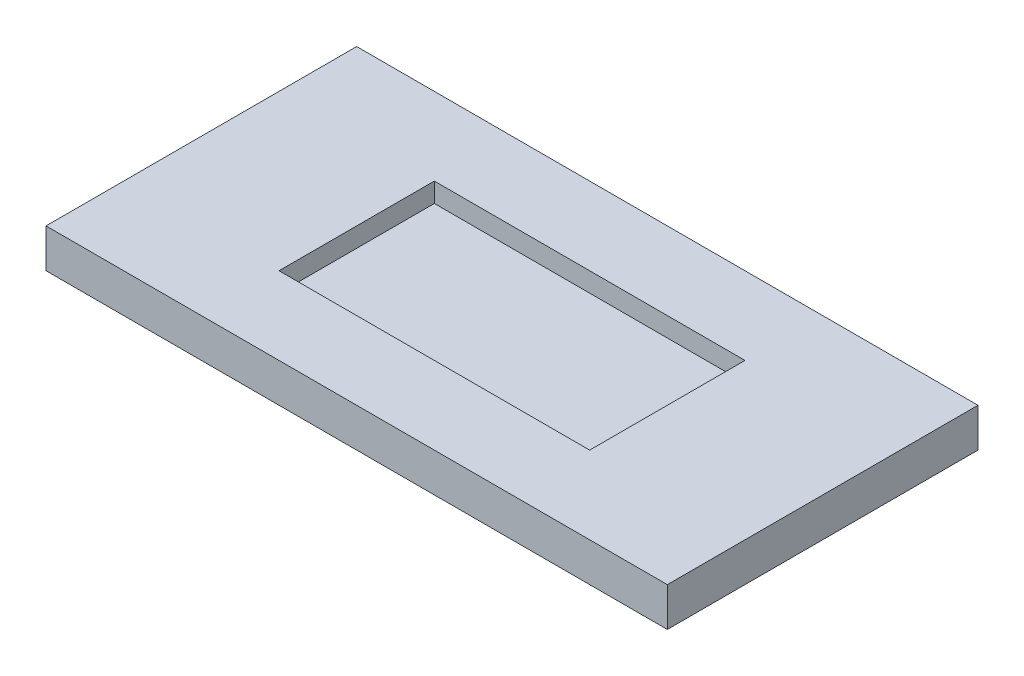
ISO-10303-21;
HEADER;
FILE_DESCRIPTION(('STEP AP214'),'2;1');
FILE_NAME('part.step','',(''),(''),'','','');
FILE_SCHEMA(('AUTOMOTIVE_DESIGN { 1 0 10303 214 1 1 1 1 }'));
ENDSEC;
DATA;
#1=APPLICATION_CONTEXT('core data for automotive mechanical design processes');
#2=APPLICATION_PROTOCOL_DEFINITION('international standard','automotive_design',2000,#1);
#3=PRODUCT_CONTEXT('',#1,'mechanical');
#4=PRODUCT('Part','Part','',(#3));
#5=PRODUCT_RELATED_PRODUCT_CATEGORY('part','',(#4));
#6=PRODUCT_DEFINITION_FORMATION('','',#4);
#7=PRODUCT_DEFINITION_CONTEXT('part definition',#1,'design');
#8=PRODUCT_DEFINITION('design','',#6,#7);
#9=PRODUCT_DEFINITION_SHAPE('','',#8);
#10=(LENGTH_UNIT() NAMED_UNIT(*) SI_UNIT(.MILLI.,.METRE.));
#11=(NAMED_UNIT(*) PLANE_ANGLE_UNIT() SI_UNIT($,.RADIAN.));
#12=(NAMED_UNIT(*) SI_UNIT($,.STERADIAN.) SOLID_ANGLE_UNIT());
#13=UNCERTAINTY_MEASURE_WITH_UNIT(LENGTH_MEASURE(1.E-05),#10,'distance_accuracy_value','');
#14=(GEOMETRIC_REPRESENTATION_CONTEXT(3) GLOBAL_UNCERTAINTY_ASSIGNED_CONTEXT((#13)) GLOBAL_UNIT_ASSIGNED_CONTEXT((#10,
#11,#12)) REPRESENTATION_CONTEXT('',''));
#15=CARTESIAN_POINT('',(0.,0.,0.));
#16=DIRECTION('',(0.,0.,1.));
#17=DIRECTION('',(1.,0.,0.));
#18=AXIS2_PLACEMENT_3D('',#15,#16,#17);
#19=CARTESIAN_POINT('',(160.,20.,80.));
#20=DIRECTION('',(-1.,0.,0.));
#21=DIRECTION('',(0.,0.,1.));
#22=AXIS2_PLACEMENT_3D('',#19,#20,#21);
#23=PLANE('',#22);
#24=DIRECTION('',(0.,0.,-1.));
#25=VECTOR('',#24,1.);
#26=CARTESIAN_POINT('',(160.,0.,80.));
#27=LINE('',#26,#25);
#28=CARTESIAN_POINT('',(160.,0.,80.));
#29=VERTEX_POINT('',#28);
#30=CARTESIAN_POINT('',(160.,0.,-80.));
#31=VERTEX_POINT('',#30);
#32=EDGE_CURVE('E145',#29,#31,#27,.T.);
#33=ORIENTED_EDGE('',*,*,#32,.T.);
#34=DIRECTION('',(0.,-1.,0.));
#35=VECTOR('',#34,1.);
#36=CARTESIAN_POINT('',(160.,20.,-80.));
#37=LINE('',#36,#35);
#38=CARTESIAN_POINT('',(160.,20.,-80.));
#39=VERTEX_POINT('',#38);
#40=EDGE_CURVE('E11',#39,#31,#37,.T.);
#41=ORIENTED_EDGE('',*,*,#40,.F.);
#42=DIRECTION('',(0.,0.,-1.));
#43=VECTOR('',#42,1.);
#44=CARTESIAN_POINT('',(160.,20.,80.));
#45=LINE('',#44,#43);
#46=CARTESIAN_POINT('',(160.,20.,80.));
#47=VERTEX_POINT('',#46);
#48=EDGE_CURVE('E149',#47,#39,#45,.T.);
#49=ORIENTED_EDGE('',*,*,#48,.F.);
#50=DIRECTION('',(0.,-1.,0.));
#51=VECTOR('',#50,1.);
#52=CARTESIAN_POINT('',(160.,20.,80.));
#53=LINE('',#52,#51);
#54=EDGE_CURVE('E155',#47,#29,#53,.T.);
#55=ORIENTED_EDGE('',*,*,#54,.T.);
#56=EDGE_LOOP('',(#33,#41,#49,#55));
#57=FACE_BOUND('',#56,.T.);
#58=ADVANCED_FACE('F37',(#57),#23,.F.);
#59=CARTESIAN_POINT('',(-160.,20.,-80.));
#60=DIRECTION('',(0.,0.,1.));
#61=DIRECTION('',(1.,0.,0.));
#62=AXIS2_PLACEMENT_3D('',#59,#60,#61);
#63=PLANE('',#62);
#64=DIRECTION('',(-1.,0.,0.));
#65=VECTOR('',#64,1.);
#66=CARTESIAN_POINT('',(-160.,0.,-80.));
#67=LINE('',#66,#65);
#68=CARTESIAN_POINT('',(-160.,0.,-80.));
#69=VERTEX_POINT('',#68);
#70=EDGE_CURVE('E158',#31,#69,#67,.T.);
#71=ORIENTED_EDGE('',*,*,#70,.T.);
#72=DIRECTION('',(0.,-1.,0.));
#73=VECTOR('',#72,1.);
#74=CARTESIAN_POINT('',(-160.,20.,-80.));
#75=LINE('',#74,#73);
#76=CARTESIAN_POINT('',(-160.,20.,-80.));
#77=VERTEX_POINT('',#76);
#78=EDGE_CURVE('E44',#77,#69,#75,.T.);
#79=ORIENTED_EDGE('',*,*,#78,.F.);
#80=DIRECTION('',(-1.,0.,0.));
#81=VECTOR('',#80,1.);
#82=CARTESIAN_POINT('',(-160.,20.,-80.));
#83=LINE('',#82,#81);
#84=EDGE_CURVE('E88',#39,#77,#83,.T.);
#85=ORIENTED_EDGE('',*,*,#84,.F.);
#86=ORIENTED_EDGE('',*,*,#40,.T.);
#87=EDGE_LOOP('',(#71,#79,#85,#86));
#88=FACE_BOUND('',#87,.T.);
#89=ADVANCED_FACE('F187',(#88),#63,.F.);
#90=CARTESIAN_POINT('',(-160.,20.,80.));
#91=DIRECTION('',(1.,0.,0.));
#92=DIRECTION('',(0.,0.,-1.));
#93=AXIS2_PLACEMENT_3D('',#90,#91,#92);
#94=PLANE('',#93);
#95=DIRECTION('',(0.,0.,1.));
#96=VECTOR('',#95,1.);
#97=CARTESIAN_POINT('',(-160.,0.,80.));
#98=LINE('',#97,#96);
#99=CARTESIAN_POINT('',(-160.,0.,80.));
#100=VERTEX_POINT('',#99);
#101=EDGE_CURVE('E160',#69,#100,#98,.T.);
#102=ORIENTED_EDGE('',*,*,#101,.T.);
#103=DIRECTION('',(0.,-1.,0.));
#104=VECTOR('',#103,1.);
#105=CARTESIAN_POINT('',(-160.,20.,80.));
#106=LINE('',#105,#104);
#107=CARTESIAN_POINT('',(-160.,20.,80.));
#108=VERTEX_POINT('',#107);
#109=EDGE_CURVE('E164',#108,#100,#106,.T.);
#110=ORIENTED_EDGE('',*,*,#109,.F.);
#111=DIRECTION('',(0.,0.,1.));
#112=VECTOR('',#111,1.);
#113=CARTESIAN_POINT('',(-160.,20.,80.));
#114=LINE('',#113,#112);
#115=EDGE_CURVE('E152',#77,#108,#114,.T.);
#116=ORIENTED_EDGE('',*,*,#115,.F.);
#117=ORIENTED_EDGE('',*,*,#78,.T.);
#118=EDGE_LOOP('',(#102,#110,#116,#117));
#119=FACE_BOUND('',#118,.T.);
#120=ADVANCED_FACE('F169',(#119),#94,.F.);
#121=CARTESIAN_POINT('',(-160.,20.,80.));
#122=DIRECTION('',(0.,0.,-1.));
#123=DIRECTION('',(-1.,0.,0.));
#124=AXIS2_PLACEMENT_3D('',#121,#122,#123);
#125=PLANE('',#124);
#126=DIRECTION('',(1.,0.,0.));
#127=VECTOR('',#126,1.);
#128=CARTESIAN_POINT('',(-160.,0.,80.));
#129=LINE('',#128,#127);
#130=EDGE_CURVE('E81',#100,#29,#129,.T.);
#131=ORIENTED_EDGE('',*,*,#130,.T.);
#132=ORIENTED_EDGE('',*,*,#54,.F.);
#133=DIRECTION('',(1.,0.,0.));
#134=VECTOR('',#133,1.);
#135=CARTESIAN_POINT('',(-160.,20.,80.));
#136=LINE('',#135,#134);
#137=EDGE_CURVE('E60',#108,#47,#136,.T.);
#138=ORIENTED_EDGE('',*,*,#137,.F.);
#139=ORIENTED_EDGE('',*,*,#109,.T.);
#140=EDGE_LOOP('',(#131,#132,#138,#139));
#141=FACE_BOUND('',#140,.T.);
#142=ADVANCED_FACE('F177',(#141),#125,.F.);
#143=CARTESIAN_POINT('',(0.,20.,0.));
#144=DIRECTION('',(0.,-1.,0.));
#145=DIRECTION('',(0.,0.,-1.));
#146=AXIS2_PLACEMENT_3D('',#143,#144,#145);
#147=PLANE('',#146);
#148=DIRECTION('',(-1.,0.,0.));
#149=VECTOR('',#148,1.);
#150=CARTESIAN_POINT('',(-80.,20.,-40.));
#151=LINE('',#150,#149);
#152=CARTESIAN_POINT('',(80.,20.,-40.));
#153=VERTEX_POINT('',#152);
#154=CARTESIAN_POINT('',(-80.,20.,-40.));
#155=VERTEX_POINT('',#154);
#156=EDGE_CURVE('E139',#153,#155,#151,.T.);
#157=ORIENTED_EDGE('',*,*,#156,.F.);
#158=DIRECTION('',(0.,0.,-1.));
#159=VECTOR('',#158,1.);
#160=CARTESIAN_POINT('',(80.,20.,40.));
#161=LINE('',#160,#159);
#162=CARTESIAN_POINT('',(80.,20.,40.));
#163=VERTEX_POINT('',#162);
#164=EDGE_CURVE('E51',#163,#153,#161,.T.);
#165=ORIENTED_EDGE('',*,*,#164,.F.);
#166=DIRECTION('',(1.,0.,0.));
#167=VECTOR('',#166,1.);
#168=CARTESIAN_POINT('',(-80.,20.,40.));
#169=LINE('',#168,#167);
#170=CARTESIAN_POINT('',(-80.,20.,40.));
#171=VERTEX_POINT('',#170);
#172=EDGE_CURVE('E130',#171,#163,#169,.T.);
#173=ORIENTED_EDGE('',*,*,#172,.F.);
#174=DIRECTION('',(0.,0.,1.));
#175=VECTOR('',#174,1.);
#176=CARTESIAN_POINT('',(-80.,20.,40.));
#177=LINE('',#176,#175);
#178=EDGE_CURVE('E133',#155,#171,#177,.T.);
#179=ORIENTED_EDGE('',*,*,#178,.F.);
#180=EDGE_LOOP('',(#157,#165,#173,#179));
#181=FACE_BOUND('',#180,.T.);
#182=ORIENTED_EDGE('',*,*,#48,.T.);
#183=ORIENTED_EDGE('',*,*,#84,.T.);
#184=ORIENTED_EDGE('',*,*,#115,.T.);
#185=ORIENTED_EDGE('',*,*,#137,.T.);
#186=EDGE_LOOP('',(#182,#183,#184,#185));
#187=FACE_BOUND('',#186,.T.);
#188=ADVANCED_FACE('F179',(#181,#187),#147,.F.);
#189=CARTESIAN_POINT('',(0.,0.,0.));
#190=DIRECTION('',(0.,-1.,0.));
#191=DIRECTION('',(0.,0.,-1.));
#192=AXIS2_PLACEMENT_3D('',#189,#190,#191);
#193=PLANE('',#192);
#194=ORIENTED_EDGE('',*,*,#32,.F.);
#195=ORIENTED_EDGE('',*,*,#130,.F.);
#196=ORIENTED_EDGE('',*,*,#101,.F.);
#197=ORIENTED_EDGE('',*,*,#70,.F.);
#198=EDGE_LOOP('',(#194,#195,#196,#197));
#199=FACE_BOUND('',#198,.T.);
#200=ADVANCED_FACE('F173',(#199),#193,.T.);
#201=CARTESIAN_POINT('',(80.,10.,40.));
#202=DIRECTION('',(1.,0.,0.));
#203=DIRECTION('',(0.,0.,-1.));
#204=AXIS2_PLACEMENT_3D('',#201,#202,#203);
#205=PLANE('',#204);
#206=ORIENTED_EDGE('',*,*,#164,.T.);
#207=DIRECTION('',(0.,1.,0.));
#208=VECTOR('',#207,1.);
#209=CARTESIAN_POINT('',(80.,10.,-40.));
#210=LINE('',#209,#208);
#211=CARTESIAN_POINT('',(80.,10.,-40.));
#212=VERTEX_POINT('',#211);
#213=EDGE_CURVE('E108',#212,#153,#210,.T.);
#214=ORIENTED_EDGE('',*,*,#213,.F.);
#215=DIRECTION('',(0.,0.,-1.));
#216=VECTOR('',#215,1.);
#217=CARTESIAN_POINT('',(80.,10.,40.));
#218=LINE('',#217,#216);
#219=CARTESIAN_POINT('',(80.,10.,40.));
#220=VERTEX_POINT('',#219);
#221=EDGE_CURVE('E112',#220,#212,#218,.T.);
#222=ORIENTED_EDGE('',*,*,#221,.F.);
#223=DIRECTION('',(0.,1.,0.));
#224=VECTOR('',#223,1.);
#225=CARTESIAN_POINT('',(80.,10.,40.));
#226=LINE('',#225,#224);
#227=EDGE_CURVE('E143',#220,#163,#226,.T.);
#228=ORIENTED_EDGE('',*,*,#227,.T.);
#229=EDGE_LOOP('',(#206,#214,#222,#228));
#230=FACE_BOUND('',#229,.T.);
#231=ADVANCED_FACE('F110',(#230),#205,.F.);
#232=CARTESIAN_POINT('',(-80.,10.,40.));
#233=DIRECTION('',(0.,0.,1.));
#234=DIRECTION('',(1.,0.,0.));
#235=AXIS2_PLACEMENT_3D('',#232,#233,#234);
#236=PLANE('',#235);
#237=ORIENTED_EDGE('',*,*,#172,.T.);
#238=ORIENTED_EDGE('',*,*,#227,.F.);
#239=DIRECTION('',(1.,0.,0.));
#240=VECTOR('',#239,1.);
#241=CARTESIAN_POINT('',(-80.,10.,40.));
#242=LINE('',#241,#240);
#243=CARTESIAN_POINT('',(-80.,10.,40.));
#244=VERTEX_POINT('',#243);
#245=EDGE_CURVE('E118',#244,#220,#242,.T.);
#246=ORIENTED_EDGE('',*,*,#245,.F.);
#247=DIRECTION('',(0.,1.,0.));
#248=VECTOR('',#247,1.);
#249=CARTESIAN_POINT('',(-80.,10.,40.));
#250=LINE('',#249,#248);
#251=EDGE_CURVE('E146',#244,#171,#250,.T.);
#252=ORIENTED_EDGE('',*,*,#251,.T.);
#253=EDGE_LOOP('',(#237,#238,#246,#252));
#254=FACE_BOUND('',#253,.T.);
#255=ADVANCED_FACE('F226',(#254),#236,.F.);
#256=CARTESIAN_POINT('',(-80.,10.,40.));
#257=DIRECTION('',(-1.,0.,0.));
#258=DIRECTION('',(0.,0.,1.));
#259=AXIS2_PLACEMENT_3D('',#256,#257,#258);
#260=PLANE('',#259);
#261=ORIENTED_EDGE('',*,*,#178,.T.);
#262=ORIENTED_EDGE('',*,*,#251,.F.);
#263=DIRECTION('',(0.,0.,1.));
#264=VECTOR('',#263,1.);
#265=CARTESIAN_POINT('',(-80.,10.,40.));
#266=LINE('',#265,#264);
#267=CARTESIAN_POINT('',(-80.,10.,-40.));
#268=VERTEX_POINT('',#267);
#269=EDGE_CURVE('E126',#268,#244,#266,.T.);
#270=ORIENTED_EDGE('',*,*,#269,.F.);
#271=DIRECTION('',(0.,1.,0.));
#272=VECTOR('',#271,1.);
#273=CARTESIAN_POINT('',(-80.,10.,-40.));
#274=LINE('',#273,#272);
#275=EDGE_CURVE('E117',#268,#155,#274,.T.);
#276=ORIENTED_EDGE('',*,*,#275,.T.);
#277=EDGE_LOOP('',(#261,#262,#270,#276));
#278=FACE_BOUND('',#277,.T.);
#279=ADVANCED_FACE('F235',(#278),#260,.F.);
#280=CARTESIAN_POINT('',(-80.,10.,-40.));
#281=DIRECTION('',(0.,0.,-1.));
#282=DIRECTION('',(-1.,0.,0.));
#283=AXIS2_PLACEMENT_3D('',#280,#281,#282);
#284=PLANE('',#283);
#285=ORIENTED_EDGE('',*,*,#156,.T.);
#286=ORIENTED_EDGE('',*,*,#275,.F.);
#287=DIRECTION('',(-1.,0.,0.));
#288=VECTOR('',#287,1.);
#289=CARTESIAN_POINT('',(-80.,10.,-40.));
#290=LINE('',#289,#288);
#291=EDGE_CURVE('E121',#212,#268,#290,.T.);
#292=ORIENTED_EDGE('',*,*,#291,.F.);
#293=ORIENTED_EDGE('',*,*,#213,.T.);
#294=EDGE_LOOP('',(#285,#286,#292,#293));
#295=FACE_BOUND('',#294,.T.);
#296=ADVANCED_FACE('F122',(#295),#284,.F.);
#297=CARTESIAN_POINT('',(0.,10.,0.));
#298=DIRECTION('',(0.,-1.,0.));
#299=DIRECTION('',(0.,0.,-1.));
#300=AXIS2_PLACEMENT_3D('',#297,#298,#299);
#301=PLANE('',#300);
#302=ORIENTED_EDGE('',*,*,#221,.T.);
#303=ORIENTED_EDGE('',*,*,#291,.T.);
#304=ORIENTED_EDGE('',*,*,#269,.T.);
#305=ORIENTED_EDGE('',*,*,#245,.T.);
#306=EDGE_LOOP('',(#302,#303,#304,#305));
#307=FACE_BOUND('',#306,.T.);
#308=ADVANCED_FACE('F128',(#307),#301,.F.);
#309=CLOSED_SHELL('',(#58,#89,#120,#142,#188,#200,#231,#255,#279,#296,#308));
#310=MANIFOLD_SOLID_BREP('B2',#309);
#311=ADVANCED_BREP_SHAPE_REPRESENTATION('',(#18,#310),#14);
#312=SHAPE_DEFINITION_REPRESENTATION(#9,#311);
ENDSEC;
END-ISO-10303-21;
